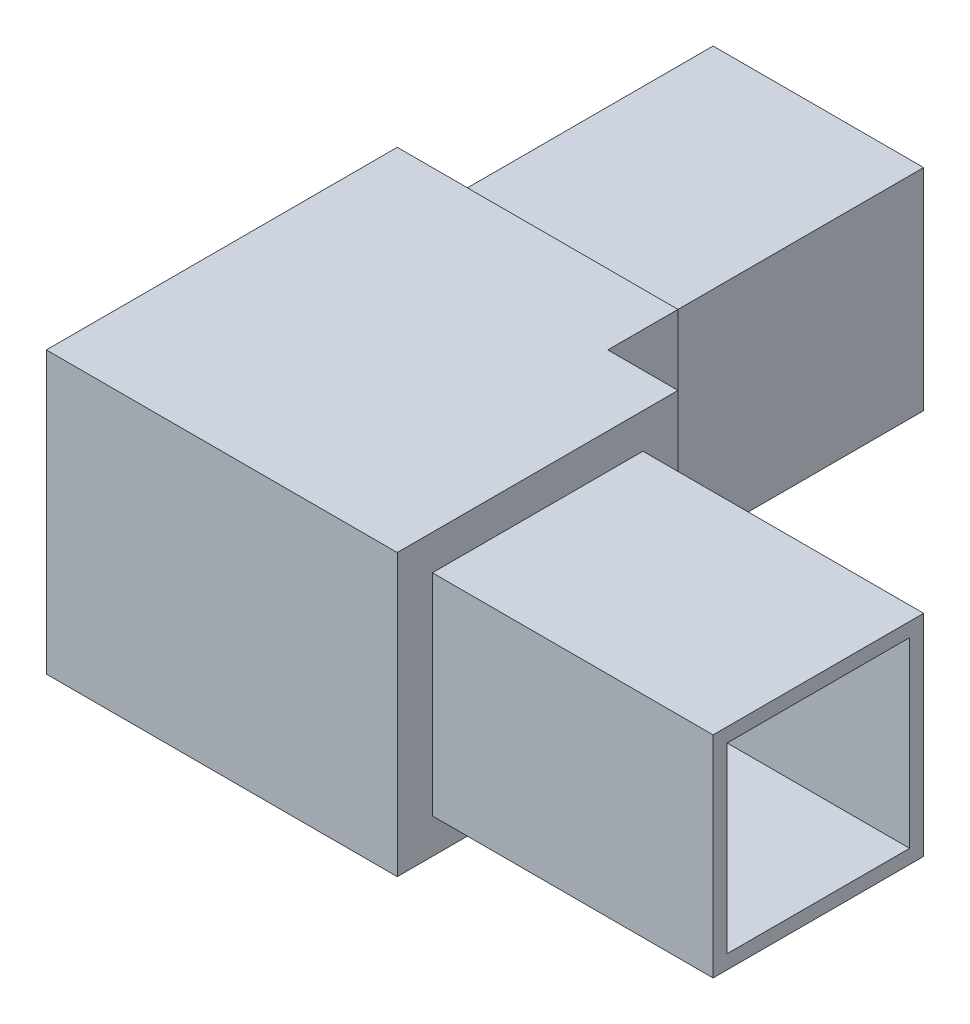
ISO-10303-21;
HEADER;
FILE_DESCRIPTION(('STEP AP214'),'2;1');
FILE_NAME('part.step','',(''),(''),'','','');
FILE_SCHEMA(('AUTOMOTIVE_DESIGN { 1 0 10303 214 1 1 1 1 }'));
ENDSEC;
DATA;
#1=APPLICATION_CONTEXT('core data for automotive mechanical design processes');
#2=APPLICATION_PROTOCOL_DEFINITION('international standard','automotive_design',2000,#1);
#3=PRODUCT_CONTEXT('',#1,'mechanical');
#4=PRODUCT('Part','Part','',(#3));
#5=PRODUCT_RELATED_PRODUCT_CATEGORY('part','',(#4));
#6=PRODUCT_DEFINITION_FORMATION('','',#4);
#7=PRODUCT_DEFINITION_CONTEXT('part definition',#1,'design');
#8=PRODUCT_DEFINITION('design','',#6,#7);
#9=PRODUCT_DEFINITION_SHAPE('','',#8);
#10=(LENGTH_UNIT() NAMED_UNIT(*) SI_UNIT(.MILLI.,.METRE.));
#11=(NAMED_UNIT(*) PLANE_ANGLE_UNIT() SI_UNIT($,.RADIAN.));
#12=(NAMED_UNIT(*) SI_UNIT($,.STERADIAN.) SOLID_ANGLE_UNIT());
#13=UNCERTAINTY_MEASURE_WITH_UNIT(LENGTH_MEASURE(1.E-05),#10,'distance_accuracy_value','');
#14=(GEOMETRIC_REPRESENTATION_CONTEXT(3) GLOBAL_UNCERTAINTY_ASSIGNED_CONTEXT((#13)) GLOBAL_UNIT_ASSIGNED_CONTEXT((#10,
#11,#12)) REPRESENTATION_CONTEXT('',''));
#15=CARTESIAN_POINT('',(0.,0.,0.));
#16=DIRECTION('',(0.,0.,1.));
#17=DIRECTION('',(1.,0.,0.));
#18=AXIS2_PLACEMENT_3D('',#15,#16,#17);
#19=CARTESIAN_POINT('',(70.,40.,-17.9567336544027));
#20=DIRECTION('',(-1.,0.,0.));
#21=DIRECTION('',(0.,0.,1.));
#22=AXIS2_PLACEMENT_3D('',#19,#20,#21);
#23=PLANE('',#22);
#24=DIRECTION('',(0.,-1.,0.));
#25=VECTOR('',#24,1.);
#26=CARTESIAN_POINT('',(70.,35.,15.));
#27=LINE('',#26,#25);
#28=CARTESIAN_POINT('',(70.,35.,15.));
#29=VERTEX_POINT('',#28);
#30=CARTESIAN_POINT('',(70.,5.,15.));
#31=VERTEX_POINT('',#30);
#32=EDGE_CURVE('E377',#29,#31,#27,.T.);
#33=ORIENTED_EDGE('',*,*,#32,.T.);
#34=DIRECTION('',(0.,0.,-1.));
#35=VECTOR('',#34,1.);
#36=CARTESIAN_POINT('',(70.,5.,15.));
#37=LINE('',#36,#35);
#38=CARTESIAN_POINT('',(70.,5.,-15.));
#39=VERTEX_POINT('',#38);
#40=EDGE_CURVE('E394',#31,#39,#37,.T.);
#41=ORIENTED_EDGE('',*,*,#40,.T.);
#42=DIRECTION('',(0.,1.,0.));
#43=VECTOR('',#42,1.);
#44=CARTESIAN_POINT('',(70.,5.,-15.));
#45=LINE('',#44,#43);
#46=CARTESIAN_POINT('',(70.,35.,-15.));
#47=VERTEX_POINT('',#46);
#48=EDGE_CURVE('E397',#39,#47,#45,.T.);
#49=ORIENTED_EDGE('',*,*,#48,.T.);
#50=DIRECTION('',(0.,0.,1.));
#51=VECTOR('',#50,1.);
#52=CARTESIAN_POINT('',(70.,35.,-15.));
#53=LINE('',#52,#51);
#54=EDGE_CURVE('E382',#47,#29,#53,.T.);
#55=ORIENTED_EDGE('',*,*,#54,.T.);
#56=EDGE_LOOP('',(#33,#41,#49,#55));
#57=FACE_BOUND('',#56,.T.);
#58=DIRECTION('',(0.,-1.,0.));
#59=VECTOR('',#58,1.);
#60=CARTESIAN_POINT('',(70.,35.,13.));
#61=LINE('',#60,#59);
#62=CARTESIAN_POINT('',(70.,33.,13.));
#63=VERTEX_POINT('',#62);
#64=CARTESIAN_POINT('',(70.,7.,13.));
#65=VERTEX_POINT('',#64);
#66=EDGE_CURVE('E231',#63,#65,#61,.T.);
#67=ORIENTED_EDGE('',*,*,#66,.F.);
#68=DIRECTION('',(0.,0.,1.));
#69=VECTOR('',#68,1.);
#70=CARTESIAN_POINT('',(70.,33.,-15.));
#71=LINE('',#70,#69);
#72=CARTESIAN_POINT('',(70.,33.,-13.));
#73=VERTEX_POINT('',#72);
#74=EDGE_CURVE('E291',#73,#63,#71,.T.);
#75=ORIENTED_EDGE('',*,*,#74,.F.);
#76=DIRECTION('',(0.,1.,0.));
#77=VECTOR('',#76,1.);
#78=CARTESIAN_POINT('',(70.,5.,-13.));
#79=LINE('',#78,#77);
#80=CARTESIAN_POINT('',(70.,7.,-13.));
#81=VERTEX_POINT('',#80);
#82=EDGE_CURVE('E48',#81,#73,#79,.T.);
#83=ORIENTED_EDGE('',*,*,#82,.F.);
#84=DIRECTION('',(0.,0.,-1.));
#85=VECTOR('',#84,1.);
#86=CARTESIAN_POINT('',(70.,7.,15.));
#87=LINE('',#86,#85);
#88=EDGE_CURVE('E322',#65,#81,#87,.T.);
#89=ORIENTED_EDGE('',*,*,#88,.F.);
#90=EDGE_LOOP('',(#67,#75,#83,#89));
#91=FACE_BOUND('',#90,.T.);
#92=ADVANCED_FACE('F32',(#57,#91),#23,.F.);
#93=CARTESIAN_POINT('',(-103.501393306404,40.,-17.9567336544027));
#94=DIRECTION('',(0.,1.,0.));
#95=DIRECTION('',(0.,0.,1.));
#96=AXIS2_PLACEMENT_3D('',#93,#94,#95);
#97=PLANE('',#96);
#98=DIRECTION('',(0.,0.,-1.));
#99=VECTOR('',#98,1.);
#100=CARTESIAN_POINT('',(20.,40.,-17.9567336544027));
#101=LINE('',#100,#99);
#102=CARTESIAN_POINT('',(20.,40.,-20.));
#103=VERTEX_POINT('',#102);
#104=CARTESIAN_POINT('',(20.,40.,-30.));
#105=VERTEX_POINT('',#104);
#106=EDGE_CURVE('E428',#103,#105,#101,.T.);
#107=ORIENTED_EDGE('',*,*,#106,.T.);
#108=DIRECTION('',(1.,0.,0.));
#109=VECTOR('',#108,1.);
#110=CARTESIAN_POINT('',(-20.,40.,-30.));
#111=LINE('',#110,#109);
#112=CARTESIAN_POINT('',(-20.,40.,-30.));
#113=VERTEX_POINT('',#112);
#114=EDGE_CURVE('E375',#113,#105,#111,.T.);
#115=ORIENTED_EDGE('',*,*,#114,.F.);
#116=DIRECTION('',(0.,0.,-1.));
#117=VECTOR('',#116,1.);
#118=CARTESIAN_POINT('',(-20.,40.,-17.9567336544027));
#119=LINE('',#118,#117);
#120=CARTESIAN_POINT('',(-20.,40.,20.));
#121=VERTEX_POINT('',#120);
#122=EDGE_CURVE('E419',#121,#113,#119,.T.);
#123=ORIENTED_EDGE('',*,*,#122,.F.);
#124=DIRECTION('',(-1.,0.,0.));
#125=VECTOR('',#124,1.);
#126=CARTESIAN_POINT('',(-103.501393306404,40.,20.));
#127=LINE('',#126,#125);
#128=CARTESIAN_POINT('',(30.,40.,20.));
#129=VERTEX_POINT('',#128);
#130=EDGE_CURVE('E422',#129,#121,#127,.T.);
#131=ORIENTED_EDGE('',*,*,#130,.F.);
#132=DIRECTION('',(0.,0.,1.));
#133=VECTOR('',#132,1.);
#134=CARTESIAN_POINT('',(30.,40.,-20.));
#135=LINE('',#134,#133);
#136=CARTESIAN_POINT('',(30.,40.,-20.));
#137=VERTEX_POINT('',#136);
#138=EDGE_CURVE('E416',#137,#129,#135,.T.);
#139=ORIENTED_EDGE('',*,*,#138,.F.);
#140=DIRECTION('',(1.,0.,0.));
#141=VECTOR('',#140,1.);
#142=CARTESIAN_POINT('',(-103.501393306404,40.,-20.));
#143=LINE('',#142,#141);
#144=EDGE_CURVE('E425',#103,#137,#143,.T.);
#145=ORIENTED_EDGE('',*,*,#144,.F.);
#146=EDGE_LOOP('',(#107,#115,#123,#131,#139,#145));
#147=FACE_BOUND('',#146,.T.);
#148=ADVANCED_FACE('F460',(#147),#97,.T.);
#149=CARTESIAN_POINT('',(-103.501393306404,0.,-17.9567336544027));
#150=DIRECTION('',(0.,1.,0.));
#151=DIRECTION('',(0.,0.,1.));
#152=AXIS2_PLACEMENT_3D('',#149,#150,#151);
#153=PLANE('',#152);
#154=DIRECTION('',(-1.,0.,0.));
#155=VECTOR('',#154,1.);
#156=CARTESIAN_POINT('',(20.,0.,-30.));
#157=LINE('',#156,#155);
#158=CARTESIAN_POINT('',(20.,0.,-30.));
#159=VERTEX_POINT('',#158);
#160=CARTESIAN_POINT('',(-20.,0.,-30.));
#161=VERTEX_POINT('',#160);
#162=EDGE_CURVE('E371',#159,#161,#157,.T.);
#163=ORIENTED_EDGE('',*,*,#162,.F.);
#164=DIRECTION('',(0.,0.,-1.));
#165=VECTOR('',#164,1.);
#166=CARTESIAN_POINT('',(20.,0.,-17.9567336544027));
#167=LINE('',#166,#165);
#168=CARTESIAN_POINT('',(20.,0.,-20.));
#169=VERTEX_POINT('',#168);
#170=EDGE_CURVE('E423',#169,#159,#167,.T.);
#171=ORIENTED_EDGE('',*,*,#170,.F.);
#172=DIRECTION('',(1.,0.,0.));
#173=VECTOR('',#172,1.);
#174=CARTESIAN_POINT('',(-103.501393306404,0.,-20.));
#175=LINE('',#174,#173);
#176=CARTESIAN_POINT('',(30.,0.,-20.));
#177=VERTEX_POINT('',#176);
#178=EDGE_CURVE('E435',#169,#177,#175,.T.);
#179=ORIENTED_EDGE('',*,*,#178,.T.);
#180=DIRECTION('',(0.,0.,-1.));
#181=VECTOR('',#180,1.);
#182=CARTESIAN_POINT('',(30.,0.,20.));
#183=LINE('',#182,#181);
#184=CARTESIAN_POINT('',(30.,0.,20.));
#185=VERTEX_POINT('',#184);
#186=EDGE_CURVE('E412',#185,#177,#183,.T.);
#187=ORIENTED_EDGE('',*,*,#186,.F.);
#188=DIRECTION('',(-1.,0.,0.));
#189=VECTOR('',#188,1.);
#190=CARTESIAN_POINT('',(-103.501393306404,0.,20.));
#191=LINE('',#190,#189);
#192=CARTESIAN_POINT('',(-20.,0.,20.));
#193=VERTEX_POINT('',#192);
#194=EDGE_CURVE('E433',#185,#193,#191,.T.);
#195=ORIENTED_EDGE('',*,*,#194,.T.);
#196=DIRECTION('',(0.,0.,-1.));
#197=VECTOR('',#196,1.);
#198=CARTESIAN_POINT('',(-20.,0.,-17.9567336544027));
#199=LINE('',#198,#197);
#200=EDGE_CURVE('E418',#193,#161,#199,.T.);
#201=ORIENTED_EDGE('',*,*,#200,.T.);
#202=EDGE_LOOP('',(#163,#171,#179,#187,#195,#201));
#203=FACE_BOUND('',#202,.T.);
#204=ADVANCED_FACE('F450',(#203),#153,.F.);
#205=CARTESIAN_POINT('',(-20.,40.,-17.9567336544027));
#206=DIRECTION('',(-1.,0.,0.));
#207=DIRECTION('',(0.,0.,1.));
#208=AXIS2_PLACEMENT_3D('',#205,#206,#207);
#209=PLANE('',#208);
#210=CARTESIAN_POINT('',(-20.,20.,0.));
#211=DIRECTION('',(-1.,0.,0.));
#212=DIRECTION('',(0.,0.,1.));
#213=AXIS2_PLACEMENT_3D('',#210,#211,#212);
#214=CIRCLE('',#213,10.);
#215=CARTESIAN_POINT('',(-20.,20.,10.));
#216=VERTEX_POINT('',#215);
#217=EDGE_CURVE('E252',#216,#216,#214,.T.);
#218=ORIENTED_EDGE('',*,*,#217,.F.);
#219=EDGE_LOOP('',(#218));
#220=FACE_BOUND('',#219,.T.);
#221=ORIENTED_EDGE('',*,*,#122,.T.);
#222=DIRECTION('',(0.,1.,0.));
#223=VECTOR('',#222,1.);
#224=CARTESIAN_POINT('',(-20.,0.,-30.));
#225=LINE('',#224,#223);
#226=EDGE_CURVE('E373',#161,#113,#225,.T.);
#227=ORIENTED_EDGE('',*,*,#226,.F.);
#228=ORIENTED_EDGE('',*,*,#200,.F.);
#229=DIRECTION('',(0.,-1.,0.));
#230=VECTOR('',#229,1.);
#231=CARTESIAN_POINT('',(-20.,40.,20.));
#232=LINE('',#231,#230);
#233=EDGE_CURVE('E11',#121,#193,#232,.T.);
#234=ORIENTED_EDGE('',*,*,#233,.F.);
#235=EDGE_LOOP('',(#221,#227,#228,#234));
#236=FACE_BOUND('',#235,.T.);
#237=ADVANCED_FACE('F34',(#220,#236),#209,.T.);
#238=CARTESIAN_POINT('',(20.,40.,-17.9567336544027));
#239=DIRECTION('',(-1.,0.,0.));
#240=DIRECTION('',(0.,0.,1.));
#241=AXIS2_PLACEMENT_3D('',#238,#239,#240);
#242=PLANE('',#241);
#243=DIRECTION('',(0.,-1.,0.));
#244=VECTOR('',#243,1.);
#245=CARTESIAN_POINT('',(20.,40.,-30.));
#246=LINE('',#245,#244);
#247=EDGE_CURVE('E363',#105,#159,#246,.T.);
#248=ORIENTED_EDGE('',*,*,#247,.F.);
#249=ORIENTED_EDGE('',*,*,#106,.F.);
#250=DIRECTION('',(0.,-1.,0.));
#251=VECTOR('',#250,1.);
#252=CARTESIAN_POINT('',(20.,40.,-20.));
#253=LINE('',#252,#251);
#254=EDGE_CURVE('E41',#103,#169,#253,.T.);
#255=ORIENTED_EDGE('',*,*,#254,.T.);
#256=ORIENTED_EDGE('',*,*,#170,.T.);
#257=EDGE_LOOP('',(#248,#249,#255,#256));
#258=FACE_BOUND('',#257,.T.);
#259=ADVANCED_FACE('F444',(#258),#242,.F.);
#260=CARTESIAN_POINT('',(-103.501393306404,40.,20.));
#261=DIRECTION('',(0.,0.,1.));
#262=DIRECTION('',(1.,0.,0.));
#263=AXIS2_PLACEMENT_3D('',#260,#261,#262);
#264=PLANE('',#263);
#265=ORIENTED_EDGE('',*,*,#194,.F.);
#266=DIRECTION('',(0.,-1.,0.));
#267=VECTOR('',#266,1.);
#268=CARTESIAN_POINT('',(30.,40.,20.));
#269=LINE('',#268,#267);
#270=EDGE_CURVE('E404',#129,#185,#269,.T.);
#271=ORIENTED_EDGE('',*,*,#270,.F.);
#272=ORIENTED_EDGE('',*,*,#130,.T.);
#273=ORIENTED_EDGE('',*,*,#233,.T.);
#274=EDGE_LOOP('',(#265,#271,#272,#273));
#275=FACE_BOUND('',#274,.T.);
#276=ADVANCED_FACE('F466',(#275),#264,.T.);
#277=CARTESIAN_POINT('',(-103.501393306404,40.,-20.));
#278=DIRECTION('',(0.,0.,-1.));
#279=DIRECTION('',(-1.,0.,0.));
#280=AXIS2_PLACEMENT_3D('',#277,#278,#279);
#281=PLANE('',#280);
#282=ORIENTED_EDGE('',*,*,#144,.T.);
#283=DIRECTION('',(0.,1.,0.));
#284=VECTOR('',#283,1.);
#285=CARTESIAN_POINT('',(30.,0.,-20.));
#286=LINE('',#285,#284);
#287=EDGE_CURVE('E414',#177,#137,#286,.T.);
#288=ORIENTED_EDGE('',*,*,#287,.F.);
#289=ORIENTED_EDGE('',*,*,#178,.F.);
#290=ORIENTED_EDGE('',*,*,#254,.F.);
#291=EDGE_LOOP('',(#282,#288,#289,#290));
#292=FACE_BOUND('',#291,.T.);
#293=ADVANCED_FACE('F453',(#292),#281,.T.);
#294=CARTESIAN_POINT('',(30.,0.,20.));
#295=DIRECTION('',(1.,0.,0.));
#296=DIRECTION('',(0.,0.,-1.));
#297=AXIS2_PLACEMENT_3D('',#294,#295,#296);
#298=PLANE('',#297);
#299=DIRECTION('',(0.,0.,1.));
#300=VECTOR('',#299,1.);
#301=CARTESIAN_POINT('',(30.,35.,-15.));
#302=LINE('',#301,#300);
#303=CARTESIAN_POINT('',(30.,35.,-15.));
#304=VERTEX_POINT('',#303);
#305=CARTESIAN_POINT('',(30.,35.,15.));
#306=VERTEX_POINT('',#305);
#307=EDGE_CURVE('E388',#304,#306,#302,.T.);
#308=ORIENTED_EDGE('',*,*,#307,.F.);
#309=DIRECTION('',(0.,1.,0.));
#310=VECTOR('',#309,1.);
#311=CARTESIAN_POINT('',(30.,5.,-15.));
#312=LINE('',#311,#310);
#313=CARTESIAN_POINT('',(30.,5.,-15.));
#314=VERTEX_POINT('',#313);
#315=EDGE_CURVE('E385',#314,#304,#312,.T.);
#316=ORIENTED_EDGE('',*,*,#315,.F.);
#317=DIRECTION('',(0.,0.,-1.));
#318=VECTOR('',#317,1.);
#319=CARTESIAN_POINT('',(30.,5.,15.));
#320=LINE('',#319,#318);
#321=CARTESIAN_POINT('',(30.,5.,15.));
#322=VERTEX_POINT('',#321);
#323=EDGE_CURVE('E381',#322,#314,#320,.T.);
#324=ORIENTED_EDGE('',*,*,#323,.F.);
#325=DIRECTION('',(0.,-1.,0.));
#326=VECTOR('',#325,1.);
#327=CARTESIAN_POINT('',(30.,35.,15.));
#328=LINE('',#327,#326);
#329=EDGE_CURVE('E378',#306,#322,#328,.T.);
#330=ORIENTED_EDGE('',*,*,#329,.F.);
#331=EDGE_LOOP('',(#308,#316,#324,#330));
#332=FACE_BOUND('',#331,.T.);
#333=ORIENTED_EDGE('',*,*,#270,.T.);
#334=ORIENTED_EDGE('',*,*,#186,.T.);
#335=ORIENTED_EDGE('',*,*,#287,.T.);
#336=ORIENTED_EDGE('',*,*,#138,.T.);
#337=EDGE_LOOP('',(#333,#334,#335,#336));
#338=FACE_BOUND('',#337,.T.);
#339=ADVANCED_FACE('F456',(#332,#338),#298,.T.);
#340=CARTESIAN_POINT('',(30.,35.,15.));
#341=DIRECTION('',(0.,0.,1.));
#342=DIRECTION('',(1.,0.,0.));
#343=AXIS2_PLACEMENT_3D('',#340,#341,#342);
#344=PLANE('',#343);
#345=ORIENTED_EDGE('',*,*,#32,.F.);
#346=DIRECTION('',(1.,0.,0.));
#347=VECTOR('',#346,1.);
#348=CARTESIAN_POINT('',(30.,35.,15.));
#349=LINE('',#348,#347);
#350=EDGE_CURVE('E402',#306,#29,#349,.T.);
#351=ORIENTED_EDGE('',*,*,#350,.F.);
#352=ORIENTED_EDGE('',*,*,#329,.T.);
#353=DIRECTION('',(1.,0.,0.));
#354=VECTOR('',#353,1.);
#355=CARTESIAN_POINT('',(30.,5.,15.));
#356=LINE('',#355,#354);
#357=EDGE_CURVE('E391',#322,#31,#356,.T.);
#358=ORIENTED_EDGE('',*,*,#357,.T.);
#359=EDGE_LOOP('',(#345,#351,#352,#358));
#360=FACE_BOUND('',#359,.T.);
#361=ADVANCED_FACE('F519',(#360),#344,.T.);
#362=CARTESIAN_POINT('',(30.,35.,-15.));
#363=DIRECTION('',(0.,1.,0.));
#364=DIRECTION('',(0.,0.,1.));
#365=AXIS2_PLACEMENT_3D('',#362,#363,#364);
#366=PLANE('',#365);
#367=ORIENTED_EDGE('',*,*,#54,.F.);
#368=DIRECTION('',(1.,0.,0.));
#369=VECTOR('',#368,1.);
#370=CARTESIAN_POINT('',(30.,35.,-15.));
#371=LINE('',#370,#369);
#372=EDGE_CURVE('E405',#304,#47,#371,.T.);
#373=ORIENTED_EDGE('',*,*,#372,.F.);
#374=ORIENTED_EDGE('',*,*,#307,.T.);
#375=ORIENTED_EDGE('',*,*,#350,.T.);
#376=EDGE_LOOP('',(#367,#373,#374,#375));
#377=FACE_BOUND('',#376,.T.);
#378=ADVANCED_FACE('F522',(#377),#366,.T.);
#379=CARTESIAN_POINT('',(30.,5.,-15.));
#380=DIRECTION('',(0.,0.,-1.));
#381=DIRECTION('',(-1.,0.,0.));
#382=AXIS2_PLACEMENT_3D('',#379,#380,#381);
#383=PLANE('',#382);
#384=ORIENTED_EDGE('',*,*,#48,.F.);
#385=DIRECTION('',(1.,0.,0.));
#386=VECTOR('',#385,1.);
#387=CARTESIAN_POINT('',(30.,5.,-15.));
#388=LINE('',#387,#386);
#389=EDGE_CURVE('E407',#314,#39,#388,.T.);
#390=ORIENTED_EDGE('',*,*,#389,.F.);
#391=ORIENTED_EDGE('',*,*,#315,.T.);
#392=ORIENTED_EDGE('',*,*,#372,.T.);
#393=EDGE_LOOP('',(#384,#390,#391,#392));
#394=FACE_BOUND('',#393,.T.);
#395=ADVANCED_FACE('F484',(#394),#383,.T.);
#396=CARTESIAN_POINT('',(30.,5.,15.));
#397=DIRECTION('',(0.,-1.,0.));
#398=DIRECTION('',(0.,0.,-1.));
#399=AXIS2_PLACEMENT_3D('',#396,#397,#398);
#400=PLANE('',#399);
#401=ORIENTED_EDGE('',*,*,#40,.F.);
#402=ORIENTED_EDGE('',*,*,#357,.F.);
#403=ORIENTED_EDGE('',*,*,#323,.T.);
#404=ORIENTED_EDGE('',*,*,#389,.T.);
#405=EDGE_LOOP('',(#401,#402,#403,#404));
#406=FACE_BOUND('',#405,.T.);
#407=ADVANCED_FACE('F474',(#406),#400,.T.);
#408=CARTESIAN_POINT('',(20.,0.,-30.));
#409=DIRECTION('',(0.,0.,-1.));
#410=DIRECTION('',(-1.,0.,0.));
#411=AXIS2_PLACEMENT_3D('',#408,#409,#410);
#412=PLANE('',#411);
#413=DIRECTION('',(1.,0.,0.));
#414=VECTOR('',#413,1.);
#415=CARTESIAN_POINT('',(-15.,35.,-30.));
#416=LINE('',#415,#414);
#417=CARTESIAN_POINT('',(-15.,35.,-30.));
#418=VERTEX_POINT('',#417);
#419=CARTESIAN_POINT('',(15.,35.,-30.));
#420=VERTEX_POINT('',#419);
#421=EDGE_CURVE('E347',#418,#420,#416,.T.);
#422=ORIENTED_EDGE('',*,*,#421,.F.);
#423=DIRECTION('',(0.,1.,0.));
#424=VECTOR('',#423,1.);
#425=CARTESIAN_POINT('',(-15.,5.,-30.));
#426=LINE('',#425,#424);
#427=CARTESIAN_POINT('',(-15.,5.,-30.));
#428=VERTEX_POINT('',#427);
#429=EDGE_CURVE('E344',#428,#418,#426,.T.);
#430=ORIENTED_EDGE('',*,*,#429,.F.);
#431=DIRECTION('',(-1.,0.,0.));
#432=VECTOR('',#431,1.);
#433=CARTESIAN_POINT('',(15.,5.,-30.));
#434=LINE('',#433,#432);
#435=CARTESIAN_POINT('',(15.,5.,-30.));
#436=VERTEX_POINT('',#435);
#437=EDGE_CURVE('E340',#436,#428,#434,.T.);
#438=ORIENTED_EDGE('',*,*,#437,.F.);
#439=DIRECTION('',(0.,-1.,0.));
#440=VECTOR('',#439,1.);
#441=CARTESIAN_POINT('',(15.,35.,-30.));
#442=LINE('',#441,#440);
#443=EDGE_CURVE('E337',#420,#436,#442,.T.);
#444=ORIENTED_EDGE('',*,*,#443,.F.);
#445=EDGE_LOOP('',(#422,#430,#438,#444));
#446=FACE_BOUND('',#445,.T.);
#447=ORIENTED_EDGE('',*,*,#247,.T.);
#448=ORIENTED_EDGE('',*,*,#162,.T.);
#449=ORIENTED_EDGE('',*,*,#226,.T.);
#450=ORIENTED_EDGE('',*,*,#114,.T.);
#451=EDGE_LOOP('',(#447,#448,#449,#450));
#452=FACE_BOUND('',#451,.T.);
#453=ADVANCED_FACE('F471',(#446,#452),#412,.T.);
#454=CARTESIAN_POINT('',(15.,35.,-30.));
#455=DIRECTION('',(1.,0.,0.));
#456=DIRECTION('',(0.,0.,-1.));
#457=AXIS2_PLACEMENT_3D('',#454,#455,#456);
#458=PLANE('',#457);
#459=DIRECTION('',(0.,-1.,0.));
#460=VECTOR('',#459,1.);
#461=CARTESIAN_POINT('',(15.,35.,-70.));
#462=LINE('',#461,#460);
#463=CARTESIAN_POINT('',(15.,35.,-70.));
#464=VERTEX_POINT('',#463);
#465=CARTESIAN_POINT('',(15.,5.,-70.));
#466=VERTEX_POINT('',#465);
#467=EDGE_CURVE('E267',#464,#466,#462,.T.);
#468=ORIENTED_EDGE('',*,*,#467,.F.);
#469=DIRECTION('',(0.,0.,-1.));
#470=VECTOR('',#469,1.);
#471=CARTESIAN_POINT('',(15.,35.,-30.));
#472=LINE('',#471,#470);
#473=EDGE_CURVE('E361',#420,#464,#472,.T.);
#474=ORIENTED_EDGE('',*,*,#473,.F.);
#475=ORIENTED_EDGE('',*,*,#443,.T.);
#476=DIRECTION('',(0.,0.,-1.));
#477=VECTOR('',#476,1.);
#478=CARTESIAN_POINT('',(15.,5.,-30.));
#479=LINE('',#478,#477);
#480=EDGE_CURVE('E350',#436,#466,#479,.T.);
#481=ORIENTED_EDGE('',*,*,#480,.T.);
#482=EDGE_LOOP('',(#468,#474,#475,#481));
#483=FACE_BOUND('',#482,.T.);
#484=ADVANCED_FACE('F473',(#483),#458,.T.);
#485=CARTESIAN_POINT('',(-15.,35.,-30.));
#486=DIRECTION('',(0.,1.,0.));
#487=DIRECTION('',(0.,0.,1.));
#488=AXIS2_PLACEMENT_3D('',#485,#486,#487);
#489=PLANE('',#488);
#490=DIRECTION('',(1.,0.,0.));
#491=VECTOR('',#490,1.);
#492=CARTESIAN_POINT('',(-15.,35.,-70.));
#493=LINE('',#492,#491);
#494=CARTESIAN_POINT('',(-15.,35.,-70.));
#495=VERTEX_POINT('',#494);
#496=EDGE_CURVE('E341',#495,#464,#493,.T.);
#497=ORIENTED_EDGE('',*,*,#496,.F.);
#498=DIRECTION('',(0.,0.,-1.));
#499=VECTOR('',#498,1.);
#500=CARTESIAN_POINT('',(-15.,35.,-30.));
#501=LINE('',#500,#499);
#502=EDGE_CURVE('E364',#418,#495,#501,.T.);
#503=ORIENTED_EDGE('',*,*,#502,.F.);
#504=ORIENTED_EDGE('',*,*,#421,.T.);
#505=ORIENTED_EDGE('',*,*,#473,.T.);
#506=EDGE_LOOP('',(#497,#503,#504,#505));
#507=FACE_BOUND('',#506,.T.);
#508=ADVANCED_FACE('F481',(#507),#489,.T.);
#509=CARTESIAN_POINT('',(-15.,5.,-30.));
#510=DIRECTION('',(-1.,0.,0.));
#511=DIRECTION('',(0.,0.,1.));
#512=AXIS2_PLACEMENT_3D('',#509,#510,#511);
#513=PLANE('',#512);
#514=DIRECTION('',(0.,1.,0.));
#515=VECTOR('',#514,1.);
#516=CARTESIAN_POINT('',(-15.,5.,-70.));
#517=LINE('',#516,#515);
#518=CARTESIAN_POINT('',(-15.,5.,-70.));
#519=VERTEX_POINT('',#518);
#520=EDGE_CURVE('E356',#519,#495,#517,.T.);
#521=ORIENTED_EDGE('',*,*,#520,.F.);
#522=DIRECTION('',(0.,0.,-1.));
#523=VECTOR('',#522,1.);
#524=CARTESIAN_POINT('',(-15.,5.,-30.));
#525=LINE('',#524,#523);
#526=EDGE_CURVE('E366',#428,#519,#525,.T.);
#527=ORIENTED_EDGE('',*,*,#526,.F.);
#528=ORIENTED_EDGE('',*,*,#429,.T.);
#529=ORIENTED_EDGE('',*,*,#502,.T.);
#530=EDGE_LOOP('',(#521,#527,#528,#529));
#531=FACE_BOUND('',#530,.T.);
#532=ADVANCED_FACE('F588',(#531),#513,.T.);
#533=CARTESIAN_POINT('',(15.,5.,-30.));
#534=DIRECTION('',(0.,-1.,0.));
#535=DIRECTION('',(0.,0.,-1.));
#536=AXIS2_PLACEMENT_3D('',#533,#534,#535);
#537=PLANE('',#536);
#538=DIRECTION('',(-1.,0.,0.));
#539=VECTOR('',#538,1.);
#540=CARTESIAN_POINT('',(15.,5.,-70.));
#541=LINE('',#540,#539);
#542=EDGE_CURVE('E353',#466,#519,#541,.T.);
#543=ORIENTED_EDGE('',*,*,#542,.F.);
#544=ORIENTED_EDGE('',*,*,#480,.F.);
#545=ORIENTED_EDGE('',*,*,#437,.T.);
#546=ORIENTED_EDGE('',*,*,#526,.T.);
#547=EDGE_LOOP('',(#543,#544,#545,#546));
#548=FACE_BOUND('',#547,.T.);
#549=ADVANCED_FACE('F513',(#548),#537,.T.);
#550=CARTESIAN_POINT('',(-103.501393306404,40.,-70.));
#551=DIRECTION('',(0.,0.,-1.));
#552=DIRECTION('',(-1.,0.,0.));
#553=AXIS2_PLACEMENT_3D('',#550,#551,#552);
#554=PLANE('',#553);
#555=DIRECTION('',(1.,0.,0.));
#556=VECTOR('',#555,1.);
#557=CARTESIAN_POINT('',(-103.501393306404,33.,-70.));
#558=LINE('',#557,#556);
#559=CARTESIAN_POINT('',(-13.,33.,-70.));
#560=VERTEX_POINT('',#559);
#561=CARTESIAN_POINT('',(13.,33.,-70.));
#562=VERTEX_POINT('',#561);
#563=EDGE_CURVE('E313',#560,#562,#558,.T.);
#564=ORIENTED_EDGE('',*,*,#563,.F.);
#565=DIRECTION('',(0.,1.,0.));
#566=VECTOR('',#565,1.);
#567=CARTESIAN_POINT('',(-13.,40.,-70.));
#568=LINE('',#567,#566);
#569=CARTESIAN_POINT('',(-13.,7.,-70.));
#570=VERTEX_POINT('',#569);
#571=EDGE_CURVE('E332',#570,#560,#568,.T.);
#572=ORIENTED_EDGE('',*,*,#571,.F.);
#573=DIRECTION('',(-1.,0.,0.));
#574=VECTOR('',#573,1.);
#575=CARTESIAN_POINT('',(-103.501393306404,7.,-70.));
#576=LINE('',#575,#574);
#577=CARTESIAN_POINT('',(13.,7.,-70.));
#578=VERTEX_POINT('',#577);
#579=EDGE_CURVE('E56',#578,#570,#576,.T.);
#580=ORIENTED_EDGE('',*,*,#579,.F.);
#581=DIRECTION('',(0.,-1.,0.));
#582=VECTOR('',#581,1.);
#583=CARTESIAN_POINT('',(13.,40.,-70.));
#584=LINE('',#583,#582);
#585=EDGE_CURVE('E328',#562,#578,#584,.T.);
#586=ORIENTED_EDGE('',*,*,#585,.F.);
#587=EDGE_LOOP('',(#564,#572,#580,#586));
#588=FACE_BOUND('',#587,.T.);
#589=ORIENTED_EDGE('',*,*,#496,.T.);
#590=ORIENTED_EDGE('',*,*,#467,.T.);
#591=ORIENTED_EDGE('',*,*,#542,.T.);
#592=ORIENTED_EDGE('',*,*,#520,.T.);
#593=EDGE_LOOP('',(#589,#590,#591,#592));
#594=FACE_BOUND('',#593,.T.);
#595=ADVANCED_FACE('F510',(#588,#594),#554,.T.);
#596=CARTESIAN_POINT('',(-103.501393306404,38.,-17.9567336544027));
#597=DIRECTION('',(0.,1.,0.));
#598=DIRECTION('',(0.,0.,1.));
#599=AXIS2_PLACEMENT_3D('',#596,#597,#598);
#600=PLANE('',#599);
#601=DIRECTION('',(0.,0.,-1.));
#602=VECTOR('',#601,1.);
#603=CARTESIAN_POINT('',(18.,38.,-17.9567336544027));
#604=LINE('',#603,#602);
#605=CARTESIAN_POINT('',(18.,38.,-18.));
#606=VERTEX_POINT('',#605);
#607=CARTESIAN_POINT('',(18.,38.,-28.));
#608=VERTEX_POINT('',#607);
#609=EDGE_CURVE('E225',#606,#608,#604,.T.);
#610=ORIENTED_EDGE('',*,*,#609,.F.);
#611=DIRECTION('',(1.,0.,0.));
#612=VECTOR('',#611,1.);
#613=CARTESIAN_POINT('',(-103.501393306404,38.,-18.));
#614=LINE('',#613,#612);
#615=CARTESIAN_POINT('',(28.,38.,-18.));
#616=VERTEX_POINT('',#615);
#617=EDGE_CURVE('E245',#606,#616,#614,.T.);
#618=ORIENTED_EDGE('',*,*,#617,.T.);
#619=DIRECTION('',(0.,0.,1.));
#620=VECTOR('',#619,1.);
#621=CARTESIAN_POINT('',(28.,38.,20.));
#622=LINE('',#621,#620);
#623=CARTESIAN_POINT('',(28.,38.,18.));
#624=VERTEX_POINT('',#623);
#625=EDGE_CURVE('E257',#616,#624,#622,.T.);
#626=ORIENTED_EDGE('',*,*,#625,.T.);
#627=DIRECTION('',(-1.,0.,0.));
#628=VECTOR('',#627,1.);
#629=CARTESIAN_POINT('',(-103.501393306404,38.,18.));
#630=LINE('',#629,#628);
#631=CARTESIAN_POINT('',(-18.,38.,18.));
#632=VERTEX_POINT('',#631);
#633=EDGE_CURVE('E249',#624,#632,#630,.T.);
#634=ORIENTED_EDGE('',*,*,#633,.T.);
#635=DIRECTION('',(0.,0.,-1.));
#636=VECTOR('',#635,1.);
#637=CARTESIAN_POINT('',(-18.,38.,-17.9567336544027));
#638=LINE('',#637,#636);
#639=CARTESIAN_POINT('',(-18.,38.,-28.));
#640=VERTEX_POINT('',#639);
#641=EDGE_CURVE('E228',#632,#640,#638,.T.);
#642=ORIENTED_EDGE('',*,*,#641,.T.);
#643=DIRECTION('',(1.,0.,0.));
#644=VECTOR('',#643,1.);
#645=CARTESIAN_POINT('',(20.,38.,-28.));
#646=LINE('',#645,#644);
#647=EDGE_CURVE('E220',#640,#608,#646,.T.);
#648=ORIENTED_EDGE('',*,*,#647,.T.);
#649=EDGE_LOOP('',(#610,#618,#626,#634,#642,#648));
#650=FACE_BOUND('',#649,.T.);
#651=ADVANCED_FACE('F222',(#650),#600,.F.);
#652=CARTESIAN_POINT('',(-103.501393306404,2.,-17.9567336544027));
#653=DIRECTION('',(0.,1.,0.));
#654=DIRECTION('',(0.,0.,1.));
#655=AXIS2_PLACEMENT_3D('',#652,#653,#654);
#656=PLANE('',#655);
#657=DIRECTION('',(-1.,0.,0.));
#658=VECTOR('',#657,1.);
#659=CARTESIAN_POINT('',(-103.501393306404,2.,-28.));
#660=LINE('',#659,#658);
#661=CARTESIAN_POINT('',(18.,2.,-28.));
#662=VERTEX_POINT('',#661);
#663=CARTESIAN_POINT('',(-18.,2.,-28.));
#664=VERTEX_POINT('',#663);
#665=EDGE_CURVE('E237',#662,#664,#660,.T.);
#666=ORIENTED_EDGE('',*,*,#665,.T.);
#667=DIRECTION('',(0.,0.,-1.));
#668=VECTOR('',#667,1.);
#669=CARTESIAN_POINT('',(-18.,2.,-17.9567336544027));
#670=LINE('',#669,#668);
#671=CARTESIAN_POINT('',(-18.,2.,18.));
#672=VERTEX_POINT('',#671);
#673=EDGE_CURVE('E258',#672,#664,#670,.T.);
#674=ORIENTED_EDGE('',*,*,#673,.F.);
#675=DIRECTION('',(-1.,0.,0.));
#676=VECTOR('',#675,1.);
#677=CARTESIAN_POINT('',(-103.501393306404,2.,18.));
#678=LINE('',#677,#676);
#679=CARTESIAN_POINT('',(28.,2.,18.));
#680=VERTEX_POINT('',#679);
#681=EDGE_CURVE('E264',#680,#672,#678,.T.);
#682=ORIENTED_EDGE('',*,*,#681,.F.);
#683=DIRECTION('',(0.,0.,-1.));
#684=VECTOR('',#683,1.);
#685=CARTESIAN_POINT('',(28.,2.,-17.9567336544027));
#686=LINE('',#685,#684);
#687=CARTESIAN_POINT('',(28.,2.,-18.));
#688=VERTEX_POINT('',#687);
#689=EDGE_CURVE('E273',#680,#688,#686,.T.);
#690=ORIENTED_EDGE('',*,*,#689,.T.);
#691=DIRECTION('',(1.,0.,0.));
#692=VECTOR('',#691,1.);
#693=CARTESIAN_POINT('',(-103.501393306404,2.,-18.));
#694=LINE('',#693,#692);
#695=CARTESIAN_POINT('',(18.,2.,-18.));
#696=VERTEX_POINT('',#695);
#697=EDGE_CURVE('E270',#696,#688,#694,.T.);
#698=ORIENTED_EDGE('',*,*,#697,.F.);
#699=DIRECTION('',(0.,0.,-1.));
#700=VECTOR('',#699,1.);
#701=CARTESIAN_POINT('',(18.,2.,-17.9567336544027));
#702=LINE('',#701,#700);
#703=EDGE_CURVE('E255',#696,#662,#702,.T.);
#704=ORIENTED_EDGE('',*,*,#703,.T.);
#705=EDGE_LOOP('',(#666,#674,#682,#690,#698,#704));
#706=FACE_BOUND('',#705,.T.);
#707=ADVANCED_FACE('F626',(#706),#656,.T.);
#708=CARTESIAN_POINT('',(-18.,40.,-17.9567336544027));
#709=DIRECTION('',(-1.,0.,0.));
#710=DIRECTION('',(0.,0.,1.));
#711=AXIS2_PLACEMENT_3D('',#708,#709,#710);
#712=PLANE('',#711);
#713=CARTESIAN_POINT('',(-18.,20.,0.));
#714=DIRECTION('',(-1.,0.,0.));
#715=DIRECTION('',(0.,0.,1.));
#716=AXIS2_PLACEMENT_3D('',#713,#714,#715);
#717=CIRCLE('',#716,10.);
#718=CARTESIAN_POINT('',(-18.,20.,10.));
#719=VERTEX_POINT('',#718);
#720=EDGE_CURVE('E36',#719,#719,#717,.T.);
#721=ORIENTED_EDGE('',*,*,#720,.T.);
#722=EDGE_LOOP('',(#721));
#723=FACE_BOUND('',#722,.T.);
#724=ORIENTED_EDGE('',*,*,#641,.F.);
#725=DIRECTION('',(0.,-1.,0.));
#726=VECTOR('',#725,1.);
#727=CARTESIAN_POINT('',(-18.,40.,18.));
#728=LINE('',#727,#726);
#729=EDGE_CURVE('E247',#632,#672,#728,.T.);
#730=ORIENTED_EDGE('',*,*,#729,.T.);
#731=ORIENTED_EDGE('',*,*,#673,.T.);
#732=DIRECTION('',(0.,1.,0.));
#733=VECTOR('',#732,1.);
#734=CARTESIAN_POINT('',(-18.,0.,-28.));
#735=LINE('',#734,#733);
#736=EDGE_CURVE('E232',#664,#640,#735,.T.);
#737=ORIENTED_EDGE('',*,*,#736,.T.);
#738=EDGE_LOOP('',(#724,#730,#731,#737));
#739=FACE_BOUND('',#738,.T.);
#740=ADVANCED_FACE('F637',(#723,#739),#712,.F.);
#741=CARTESIAN_POINT('',(18.,40.,-17.9567336544027));
#742=DIRECTION('',(-1.,0.,0.));
#743=DIRECTION('',(0.,0.,1.));
#744=AXIS2_PLACEMENT_3D('',#741,#742,#743);
#745=PLANE('',#744);
#746=DIRECTION('',(0.,-1.,0.));
#747=VECTOR('',#746,1.);
#748=CARTESIAN_POINT('',(18.,40.,-28.));
#749=LINE('',#748,#747);
#750=EDGE_CURVE('E235',#608,#662,#749,.T.);
#751=ORIENTED_EDGE('',*,*,#750,.T.);
#752=ORIENTED_EDGE('',*,*,#703,.F.);
#753=DIRECTION('',(0.,-1.,0.));
#754=VECTOR('',#753,1.);
#755=CARTESIAN_POINT('',(18.,40.,-18.));
#756=LINE('',#755,#754);
#757=EDGE_CURVE('E244',#606,#696,#756,.T.);
#758=ORIENTED_EDGE('',*,*,#757,.F.);
#759=ORIENTED_EDGE('',*,*,#609,.T.);
#760=EDGE_LOOP('',(#751,#752,#758,#759));
#761=FACE_BOUND('',#760,.T.);
#762=ADVANCED_FACE('F243',(#761),#745,.T.);
#763=CARTESIAN_POINT('',(-103.501393306404,40.,18.));
#764=DIRECTION('',(0.,0.,1.));
#765=DIRECTION('',(1.,0.,0.));
#766=AXIS2_PLACEMENT_3D('',#763,#764,#765);
#767=PLANE('',#766);
#768=ORIENTED_EDGE('',*,*,#681,.T.);
#769=ORIENTED_EDGE('',*,*,#729,.F.);
#770=ORIENTED_EDGE('',*,*,#633,.F.);
#771=DIRECTION('',(0.,-1.,0.));
#772=VECTOR('',#771,1.);
#773=CARTESIAN_POINT('',(28.,0.,18.));
#774=LINE('',#773,#772);
#775=EDGE_CURVE('E275',#624,#680,#774,.T.);
#776=ORIENTED_EDGE('',*,*,#775,.T.);
#777=EDGE_LOOP('',(#768,#769,#770,#776));
#778=FACE_BOUND('',#777,.T.);
#779=ADVANCED_FACE('F650',(#778),#767,.F.);
#780=CARTESIAN_POINT('',(-103.501393306404,40.,-18.));
#781=DIRECTION('',(0.,0.,-1.));
#782=DIRECTION('',(-1.,0.,0.));
#783=AXIS2_PLACEMENT_3D('',#780,#781,#782);
#784=PLANE('',#783);
#785=ORIENTED_EDGE('',*,*,#617,.F.);
#786=ORIENTED_EDGE('',*,*,#757,.T.);
#787=ORIENTED_EDGE('',*,*,#697,.T.);
#788=DIRECTION('',(0.,1.,0.));
#789=VECTOR('',#788,1.);
#790=CARTESIAN_POINT('',(28.,0.,-18.));
#791=LINE('',#790,#789);
#792=EDGE_CURVE('E259',#688,#616,#791,.T.);
#793=ORIENTED_EDGE('',*,*,#792,.T.);
#794=EDGE_LOOP('',(#785,#786,#787,#793));
#795=FACE_BOUND('',#794,.T.);
#796=ADVANCED_FACE('F661',(#795),#784,.F.);
#797=CARTESIAN_POINT('',(28.,0.,20.));
#798=DIRECTION('',(1.,0.,0.));
#799=DIRECTION('',(0.,0.,-1.));
#800=AXIS2_PLACEMENT_3D('',#797,#798,#799);
#801=PLANE('',#800);
#802=DIRECTION('',(0.,0.,1.));
#803=VECTOR('',#802,1.);
#804=CARTESIAN_POINT('',(28.,33.,20.));
#805=LINE('',#804,#803);
#806=CARTESIAN_POINT('',(28.,33.,-13.));
#807=VERTEX_POINT('',#806);
#808=CARTESIAN_POINT('',(28.,33.,13.));
#809=VERTEX_POINT('',#808);
#810=EDGE_CURVE('E278',#807,#809,#805,.T.);
#811=ORIENTED_EDGE('',*,*,#810,.T.);
#812=DIRECTION('',(0.,-1.,0.));
#813=VECTOR('',#812,1.);
#814=CARTESIAN_POINT('',(28.,0.,13.));
#815=LINE('',#814,#813);
#816=CARTESIAN_POINT('',(28.,7.,13.));
#817=VERTEX_POINT('',#816);
#818=EDGE_CURVE('E288',#809,#817,#815,.T.);
#819=ORIENTED_EDGE('',*,*,#818,.T.);
#820=DIRECTION('',(0.,0.,-1.));
#821=VECTOR('',#820,1.);
#822=CARTESIAN_POINT('',(28.,7.,20.));
#823=LINE('',#822,#821);
#824=CARTESIAN_POINT('',(28.,7.,-13.));
#825=VERTEX_POINT('',#824);
#826=EDGE_CURVE('E285',#817,#825,#823,.T.);
#827=ORIENTED_EDGE('',*,*,#826,.T.);
#828=DIRECTION('',(0.,1.,0.));
#829=VECTOR('',#828,1.);
#830=CARTESIAN_POINT('',(28.,0.,-13.));
#831=LINE('',#830,#829);
#832=EDGE_CURVE('E282',#825,#807,#831,.T.);
#833=ORIENTED_EDGE('',*,*,#832,.T.);
#834=EDGE_LOOP('',(#811,#819,#827,#833));
#835=FACE_BOUND('',#834,.T.);
#836=ORIENTED_EDGE('',*,*,#775,.F.);
#837=ORIENTED_EDGE('',*,*,#625,.F.);
#838=ORIENTED_EDGE('',*,*,#792,.F.);
#839=ORIENTED_EDGE('',*,*,#689,.F.);
#840=EDGE_LOOP('',(#836,#837,#838,#839));
#841=FACE_BOUND('',#840,.T.);
#842=ADVANCED_FACE('F671',(#835,#841),#801,.F.);
#843=CARTESIAN_POINT('',(30.,35.,13.));
#844=DIRECTION('',(0.,0.,1.));
#845=DIRECTION('',(1.,0.,0.));
#846=AXIS2_PLACEMENT_3D('',#843,#844,#845);
#847=PLANE('',#846);
#848=ORIENTED_EDGE('',*,*,#66,.T.);
#849=DIRECTION('',(1.,0.,0.));
#850=VECTOR('',#849,1.);
#851=CARTESIAN_POINT('',(30.,7.,13.));
#852=LINE('',#851,#850);
#853=EDGE_CURVE('E281',#817,#65,#852,.T.);
#854=ORIENTED_EDGE('',*,*,#853,.F.);
#855=ORIENTED_EDGE('',*,*,#818,.F.);
#856=DIRECTION('',(1.,0.,0.));
#857=VECTOR('',#856,1.);
#858=CARTESIAN_POINT('',(30.,33.,13.));
#859=LINE('',#858,#857);
#860=EDGE_CURVE('E293',#809,#63,#859,.T.);
#861=ORIENTED_EDGE('',*,*,#860,.T.);
#862=EDGE_LOOP('',(#848,#854,#855,#861));
#863=FACE_BOUND('',#862,.T.);
#864=ADVANCED_FACE('F681',(#863),#847,.F.);
#865=CARTESIAN_POINT('',(30.,33.,-15.));
#866=DIRECTION('',(0.,1.,0.));
#867=DIRECTION('',(0.,0.,1.));
#868=AXIS2_PLACEMENT_3D('',#865,#866,#867);
#869=PLANE('',#868);
#870=ORIENTED_EDGE('',*,*,#74,.T.);
#871=ORIENTED_EDGE('',*,*,#860,.F.);
#872=ORIENTED_EDGE('',*,*,#810,.F.);
#873=DIRECTION('',(1.,0.,0.));
#874=VECTOR('',#873,1.);
#875=CARTESIAN_POINT('',(30.,33.,-13.));
#876=LINE('',#875,#874);
#877=EDGE_CURVE('E295',#807,#73,#876,.T.);
#878=ORIENTED_EDGE('',*,*,#877,.T.);
#879=EDGE_LOOP('',(#870,#871,#872,#878));
#880=FACE_BOUND('',#879,.T.);
#881=ADVANCED_FACE('F691',(#880),#869,.F.);
#882=CARTESIAN_POINT('',(30.,5.,-13.));
#883=DIRECTION('',(0.,0.,-1.));
#884=DIRECTION('',(-1.,0.,0.));
#885=AXIS2_PLACEMENT_3D('',#882,#883,#884);
#886=PLANE('',#885);
#887=ORIENTED_EDGE('',*,*,#82,.T.);
#888=ORIENTED_EDGE('',*,*,#877,.F.);
#889=ORIENTED_EDGE('',*,*,#832,.F.);
#890=DIRECTION('',(1.,0.,0.));
#891=VECTOR('',#890,1.);
#892=CARTESIAN_POINT('',(30.,7.,-13.));
#893=LINE('',#892,#891);
#894=EDGE_CURVE('E297',#825,#81,#893,.T.);
#895=ORIENTED_EDGE('',*,*,#894,.T.);
#896=EDGE_LOOP('',(#887,#888,#889,#895));
#897=FACE_BOUND('',#896,.T.);
#898=ADVANCED_FACE('F701',(#897),#886,.F.);
#899=CARTESIAN_POINT('',(30.,7.,15.));
#900=DIRECTION('',(0.,-1.,0.));
#901=DIRECTION('',(0.,0.,-1.));
#902=AXIS2_PLACEMENT_3D('',#899,#900,#901);
#903=PLANE('',#902);
#904=ORIENTED_EDGE('',*,*,#88,.T.);
#905=ORIENTED_EDGE('',*,*,#894,.F.);
#906=ORIENTED_EDGE('',*,*,#826,.F.);
#907=ORIENTED_EDGE('',*,*,#853,.T.);
#908=EDGE_LOOP('',(#904,#905,#906,#907));
#909=FACE_BOUND('',#908,.T.);
#910=ADVANCED_FACE('F711',(#909),#903,.F.);
#911=CARTESIAN_POINT('',(20.,0.,-28.));
#912=DIRECTION('',(0.,0.,-1.));
#913=DIRECTION('',(-1.,0.,0.));
#914=AXIS2_PLACEMENT_3D('',#911,#912,#913);
#915=PLANE('',#914);
#916=DIRECTION('',(1.,0.,0.));
#917=VECTOR('',#916,1.);
#918=CARTESIAN_POINT('',(20.,33.,-28.));
#919=LINE('',#918,#917);
#920=CARTESIAN_POINT('',(-13.,33.,-28.));
#921=VERTEX_POINT('',#920);
#922=CARTESIAN_POINT('',(13.,33.,-28.));
#923=VERTEX_POINT('',#922);
#924=EDGE_CURVE('E300',#921,#923,#919,.T.);
#925=ORIENTED_EDGE('',*,*,#924,.T.);
#926=DIRECTION('',(0.,-1.,0.));
#927=VECTOR('',#926,1.);
#928=CARTESIAN_POINT('',(13.,0.,-28.));
#929=LINE('',#928,#927);
#930=CARTESIAN_POINT('',(13.,7.,-28.));
#931=VERTEX_POINT('',#930);
#932=EDGE_CURVE('E310',#923,#931,#929,.T.);
#933=ORIENTED_EDGE('',*,*,#932,.T.);
#934=DIRECTION('',(-1.,0.,0.));
#935=VECTOR('',#934,1.);
#936=CARTESIAN_POINT('',(20.,7.,-28.));
#937=LINE('',#936,#935);
#938=CARTESIAN_POINT('',(-13.,7.,-28.));
#939=VERTEX_POINT('',#938);
#940=EDGE_CURVE('E307',#931,#939,#937,.T.);
#941=ORIENTED_EDGE('',*,*,#940,.T.);
#942=DIRECTION('',(0.,1.,0.));
#943=VECTOR('',#942,1.);
#944=CARTESIAN_POINT('',(-13.,0.,-28.));
#945=LINE('',#944,#943);
#946=EDGE_CURVE('E304',#939,#921,#945,.T.);
#947=ORIENTED_EDGE('',*,*,#946,.T.);
#948=EDGE_LOOP('',(#925,#933,#941,#947));
#949=FACE_BOUND('',#948,.T.);
#950=ORIENTED_EDGE('',*,*,#750,.F.);
#951=ORIENTED_EDGE('',*,*,#647,.F.);
#952=ORIENTED_EDGE('',*,*,#736,.F.);
#953=ORIENTED_EDGE('',*,*,#665,.F.);
#954=EDGE_LOOP('',(#950,#951,#952,#953));
#955=FACE_BOUND('',#954,.T.);
#956=ADVANCED_FACE('F236',(#949,#955),#915,.F.);
#957=CARTESIAN_POINT('',(13.,35.,-30.));
#958=DIRECTION('',(1.,0.,0.));
#959=DIRECTION('',(0.,0.,-1.));
#960=AXIS2_PLACEMENT_3D('',#957,#958,#959);
#961=PLANE('',#960);
#962=ORIENTED_EDGE('',*,*,#585,.T.);
#963=DIRECTION('',(0.,0.,-1.));
#964=VECTOR('',#963,1.);
#965=CARTESIAN_POINT('',(13.,7.,-30.));
#966=LINE('',#965,#964);
#967=EDGE_CURVE('E303',#931,#578,#966,.T.);
#968=ORIENTED_EDGE('',*,*,#967,.F.);
#969=ORIENTED_EDGE('',*,*,#932,.F.);
#970=DIRECTION('',(0.,0.,-1.));
#971=VECTOR('',#970,1.);
#972=CARTESIAN_POINT('',(13.,33.,-30.));
#973=LINE('',#972,#971);
#974=EDGE_CURVE('E241',#923,#562,#973,.T.);
#975=ORIENTED_EDGE('',*,*,#974,.T.);
#976=EDGE_LOOP('',(#962,#968,#969,#975));
#977=FACE_BOUND('',#976,.T.);
#978=ADVANCED_FACE('F729',(#977),#961,.F.);
#979=CARTESIAN_POINT('',(-15.,33.,-30.));
#980=DIRECTION('',(0.,1.,0.));
#981=DIRECTION('',(0.,0.,1.));
#982=AXIS2_PLACEMENT_3D('',#979,#980,#981);
#983=PLANE('',#982);
#984=ORIENTED_EDGE('',*,*,#563,.T.);
#985=ORIENTED_EDGE('',*,*,#974,.F.);
#986=ORIENTED_EDGE('',*,*,#924,.F.);
#987=DIRECTION('',(0.,0.,-1.));
#988=VECTOR('',#987,1.);
#989=CARTESIAN_POINT('',(-13.,33.,-30.));
#990=LINE('',#989,#988);
#991=EDGE_CURVE('E315',#921,#560,#990,.T.);
#992=ORIENTED_EDGE('',*,*,#991,.T.);
#993=EDGE_LOOP('',(#984,#985,#986,#992));
#994=FACE_BOUND('',#993,.T.);
#995=ADVANCED_FACE('F739',(#994),#983,.F.);
#996=CARTESIAN_POINT('',(-13.,5.,-30.));
#997=DIRECTION('',(-1.,0.,0.));
#998=DIRECTION('',(0.,0.,1.));
#999=AXIS2_PLACEMENT_3D('',#996,#997,#998);
#1000=PLANE('',#999);
#1001=ORIENTED_EDGE('',*,*,#571,.T.);
#1002=ORIENTED_EDGE('',*,*,#991,.F.);
#1003=ORIENTED_EDGE('',*,*,#946,.F.);
#1004=DIRECTION('',(0.,0.,-1.));
#1005=VECTOR('',#1004,1.);
#1006=CARTESIAN_POINT('',(-13.,7.,-30.));
#1007=LINE('',#1006,#1005);
#1008=EDGE_CURVE('E317',#939,#570,#1007,.T.);
#1009=ORIENTED_EDGE('',*,*,#1008,.T.);
#1010=EDGE_LOOP('',(#1001,#1002,#1003,#1009));
#1011=FACE_BOUND('',#1010,.T.);
#1012=ADVANCED_FACE('F749',(#1011),#1000,.F.);
#1013=CARTESIAN_POINT('',(15.,7.,-30.));
#1014=DIRECTION('',(0.,-1.,0.));
#1015=DIRECTION('',(0.,0.,-1.));
#1016=AXIS2_PLACEMENT_3D('',#1013,#1014,#1015);
#1017=PLANE('',#1016);
#1018=ORIENTED_EDGE('',*,*,#579,.T.);
#1019=ORIENTED_EDGE('',*,*,#1008,.F.);
#1020=ORIENTED_EDGE('',*,*,#940,.F.);
#1021=ORIENTED_EDGE('',*,*,#967,.T.);
#1022=EDGE_LOOP('',(#1018,#1019,#1020,#1021));
#1023=FACE_BOUND('',#1022,.T.);
#1024=ADVANCED_FACE('F759',(#1023),#1017,.F.);
#1025=CARTESIAN_POINT('',(-10.,20.,0.));
#1026=DIRECTION('',(-1.,0.,0.));
#1027=DIRECTION('',(0.,0.,1.));
#1028=AXIS2_PLACEMENT_3D('',#1025,#1026,#1027);
#1029=CYLINDRICAL_SURFACE('',#1028,10.);
#1030=ORIENTED_EDGE('',*,*,#217,.T.);
#1031=EDGE_LOOP('',(#1030));
#1032=FACE_BOUND('',#1031,.T.);
#1033=ORIENTED_EDGE('',*,*,#720,.F.);
#1034=EDGE_LOOP('',(#1033));
#1035=FACE_BOUND('',#1034,.T.);
#1036=ADVANCED_FACE('F768',(#1032,#1035),#1029,.F.);
#1037=CLOSED_SHELL('',(#92,#148,#204,#237,#259,#276,#293,#339,#361,#378,#395,#407,#453,#484,
#508,#532,#549,#595,#651,#707,#740,#762,#779,#796,#842,#864,#881,#898,#910,#956,#978,#995,#1012,
#1024,#1036));
#1038=MANIFOLD_SOLID_BREP('B2',#1037);
#1039=ADVANCED_BREP_SHAPE_REPRESENTATION('',(#18,#1038),#14);
#1040=SHAPE_DEFINITION_REPRESENTATION(#9,#1039);
ENDSEC;
END-ISO-10303-21;
